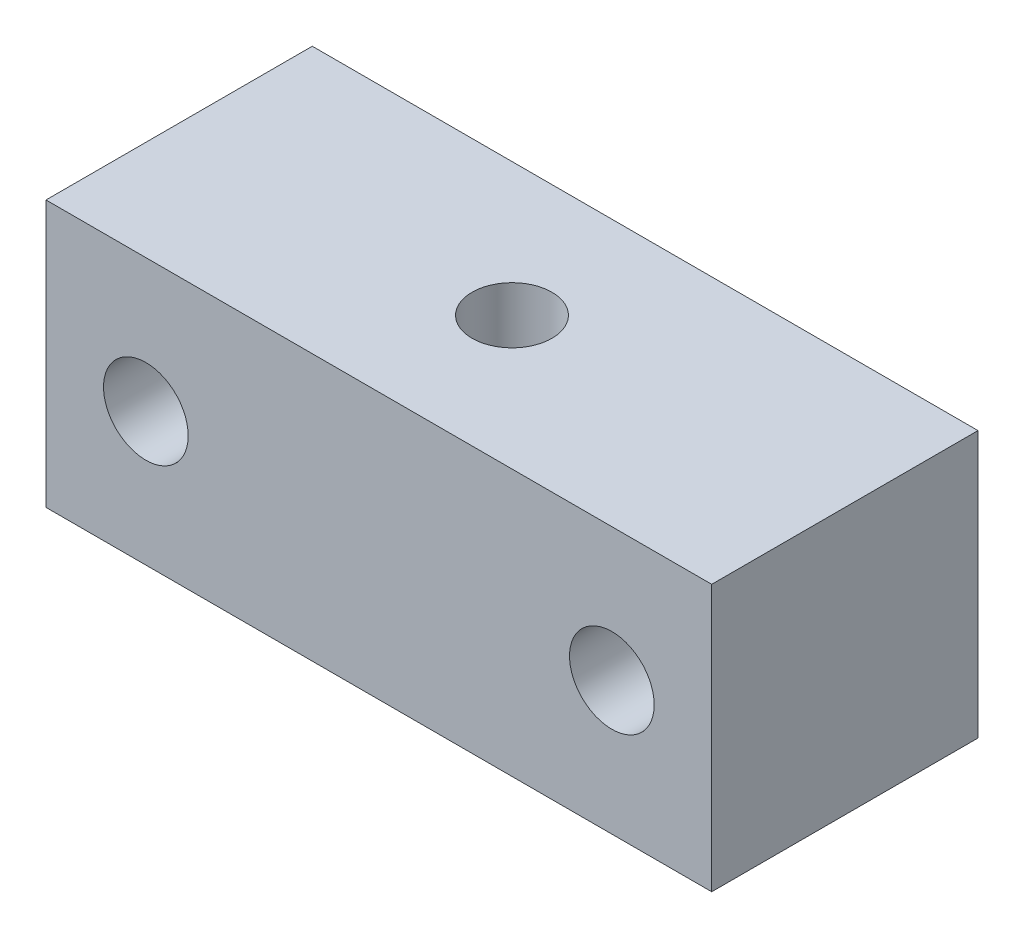
ISO-10303-21;
HEADER;
FILE_DESCRIPTION(('STEP AP214'),'2;1');
FILE_NAME('part.step','',(''),(''),'','','');
FILE_SCHEMA(('AUTOMOTIVE_DESIGN { 1 0 10303 214 1 1 1 1 }'));
ENDSEC;
DATA;
#1=APPLICATION_CONTEXT('core data for automotive mechanical design processes');
#2=APPLICATION_PROTOCOL_DEFINITION('international standard','automotive_design',2000,#1);
#3=PRODUCT_CONTEXT('',#1,'mechanical');
#4=PRODUCT('Part','Part','',(#3));
#5=PRODUCT_RELATED_PRODUCT_CATEGORY('part','',(#4));
#6=PRODUCT_DEFINITION_FORMATION('','',#4);
#7=PRODUCT_DEFINITION_CONTEXT('part definition',#1,'design');
#8=PRODUCT_DEFINITION('design','',#6,#7);
#9=PRODUCT_DEFINITION_SHAPE('','',#8);
#10=(LENGTH_UNIT() NAMED_UNIT(*) SI_UNIT(.MILLI.,.METRE.));
#11=(NAMED_UNIT(*) PLANE_ANGLE_UNIT() SI_UNIT($,.RADIAN.));
#12=(NAMED_UNIT(*) SI_UNIT($,.STERADIAN.) SOLID_ANGLE_UNIT());
#13=UNCERTAINTY_MEASURE_WITH_UNIT(LENGTH_MEASURE(1.E-05),#10,'distance_accuracy_value','');
#14=(GEOMETRIC_REPRESENTATION_CONTEXT(3) GLOBAL_UNCERTAINTY_ASSIGNED_CONTEXT((#13)) GLOBAL_UNIT_ASSIGNED_CONTEXT((#10,
#11,#12)) REPRESENTATION_CONTEXT('',''));
#15=CARTESIAN_POINT('',(0.,0.,0.));
#16=DIRECTION('',(0.,0.,1.));
#17=DIRECTION('',(1.,0.,0.));
#18=AXIS2_PLACEMENT_3D('',#15,#16,#17);
#19=CARTESIAN_POINT('',(0.,0.,6.35));
#20=DIRECTION('',(1.,0.,0.));
#21=DIRECTION('',(0.,0.,-1.));
#22=AXIS2_PLACEMENT_3D('',#19,#20,#21);
#23=PLANE('',#22);
#24=DIRECTION('',(0.,-1.,0.));
#25=VECTOR('',#24,1.);
#26=CARTESIAN_POINT('',(0.,0.,-6.35));
#27=LINE('',#26,#25);
#28=CARTESIAN_POINT('',(0.,12.7,-6.35));
#29=VERTEX_POINT('',#28);
#30=CARTESIAN_POINT('',(0.,0.,-6.35));
#31=VERTEX_POINT('',#30);
#32=EDGE_CURVE('E96',#29,#31,#27,.T.);
#33=ORIENTED_EDGE('',*,*,#32,.T.);
#34=DIRECTION('',(0.,0.,-1.));
#35=VECTOR('',#34,1.);
#36=CARTESIAN_POINT('',(0.,0.,6.35));
#37=LINE('',#36,#35);
#38=CARTESIAN_POINT('',(0.,0.,6.35));
#39=VERTEX_POINT('',#38);
#40=EDGE_CURVE('E11',#39,#31,#37,.T.);
#41=ORIENTED_EDGE('',*,*,#40,.F.);
#42=DIRECTION('',(0.,-1.,0.));
#43=VECTOR('',#42,1.);
#44=CARTESIAN_POINT('',(0.,0.,6.35));
#45=LINE('',#44,#43);
#46=CARTESIAN_POINT('',(0.,12.7,6.35));
#47=VERTEX_POINT('',#46);
#48=EDGE_CURVE('E84',#47,#39,#45,.T.);
#49=ORIENTED_EDGE('',*,*,#48,.F.);
#50=DIRECTION('',(0.,0.,-1.));
#51=VECTOR('',#50,1.);
#52=CARTESIAN_POINT('',(0.,12.7,6.35));
#53=LINE('',#52,#51);
#54=EDGE_CURVE('E92',#47,#29,#53,.T.);
#55=ORIENTED_EDGE('',*,*,#54,.T.);
#56=EDGE_LOOP('',(#33,#41,#49,#55));
#57=FACE_BOUND('',#56,.T.);
#58=ADVANCED_FACE('F33',(#57),#23,.F.);
#59=CARTESIAN_POINT('',(0.,0.,6.35));
#60=DIRECTION('',(0.,1.,0.));
#61=DIRECTION('',(0.,0.,1.));
#62=AXIS2_PLACEMENT_3D('',#59,#60,#61);
#63=PLANE('',#62);
#64=CARTESIAN_POINT('',(15.875,0.,0.));
#65=DIRECTION('',(0.,1.,0.));
#66=DIRECTION('',(0.,0.,1.));
#67=AXIS2_PLACEMENT_3D('',#64,#65,#66);
#68=CIRCLE('',#67,1.905);
#69=CARTESIAN_POINT('',(15.875,0.,1.905));
#70=VERTEX_POINT('',#69);
#71=EDGE_CURVE('E114',#70,#70,#68,.T.);
#72=ORIENTED_EDGE('',*,*,#71,.T.);
#73=EDGE_LOOP('',(#72));
#74=FACE_BOUND('',#73,.T.);
#75=DIRECTION('',(1.,0.,0.));
#76=VECTOR('',#75,1.);
#77=CARTESIAN_POINT('',(0.,0.,-6.35));
#78=LINE('',#77,#76);
#79=CARTESIAN_POINT('',(31.75,0.,-6.35));
#80=VERTEX_POINT('',#79);
#81=EDGE_CURVE('E88',#31,#80,#78,.T.);
#82=ORIENTED_EDGE('',*,*,#81,.T.);
#83=DIRECTION('',(0.,0.,-1.));
#84=VECTOR('',#83,1.);
#85=CARTESIAN_POINT('',(31.75,0.,6.35));
#86=LINE('',#85,#84);
#87=CARTESIAN_POINT('',(31.75,0.,6.35));
#88=VERTEX_POINT('',#87);
#89=EDGE_CURVE('E41',#88,#80,#86,.T.);
#90=ORIENTED_EDGE('',*,*,#89,.F.);
#91=DIRECTION('',(1.,0.,0.));
#92=VECTOR('',#91,1.);
#93=CARTESIAN_POINT('',(0.,0.,6.35));
#94=LINE('',#93,#92);
#95=EDGE_CURVE('E79',#39,#88,#94,.T.);
#96=ORIENTED_EDGE('',*,*,#95,.F.);
#97=ORIENTED_EDGE('',*,*,#40,.T.);
#98=EDGE_LOOP('',(#82,#90,#96,#97));
#99=FACE_BOUND('',#98,.T.);
#100=ADVANCED_FACE('F87',(#74,#99),#63,.F.);
#101=CARTESIAN_POINT('',(31.75,0.,6.35));
#102=DIRECTION('',(-1.,0.,0.));
#103=DIRECTION('',(0.,0.,1.));
#104=AXIS2_PLACEMENT_3D('',#101,#102,#103);
#105=PLANE('',#104);
#106=DIRECTION('',(0.,1.,0.));
#107=VECTOR('',#106,1.);
#108=CARTESIAN_POINT('',(31.75,0.,-6.35));
#109=LINE('',#108,#107);
#110=CARTESIAN_POINT('',(31.75,12.7,-6.35));
#111=VERTEX_POINT('',#110);
#112=EDGE_CURVE('E66',#80,#111,#109,.T.);
#113=ORIENTED_EDGE('',*,*,#112,.T.);
#114=DIRECTION('',(0.,0.,-1.));
#115=VECTOR('',#114,1.);
#116=CARTESIAN_POINT('',(31.75,12.7,6.35));
#117=LINE('',#116,#115);
#118=CARTESIAN_POINT('',(31.75,12.7,6.35));
#119=VERTEX_POINT('',#118);
#120=EDGE_CURVE('E89',#119,#111,#117,.T.);
#121=ORIENTED_EDGE('',*,*,#120,.F.);
#122=DIRECTION('',(0.,1.,0.));
#123=VECTOR('',#122,1.);
#124=CARTESIAN_POINT('',(31.75,0.,6.35));
#125=LINE('',#124,#123);
#126=EDGE_CURVE('E82',#88,#119,#125,.T.);
#127=ORIENTED_EDGE('',*,*,#126,.F.);
#128=ORIENTED_EDGE('',*,*,#89,.T.);
#129=EDGE_LOOP('',(#113,#121,#127,#128));
#130=FACE_BOUND('',#129,.T.);
#131=ADVANCED_FACE('F90',(#130),#105,.F.);
#132=CARTESIAN_POINT('',(0.,12.7,6.35));
#133=DIRECTION('',(0.,-1.,0.));
#134=DIRECTION('',(0.,0.,-1.));
#135=AXIS2_PLACEMENT_3D('',#132,#133,#134);
#136=PLANE('',#135);
#137=CARTESIAN_POINT('',(15.875,12.7,0.));
#138=DIRECTION('',(0.,1.,0.));
#139=DIRECTION('',(0.,0.,1.));
#140=AXIS2_PLACEMENT_3D('',#137,#138,#139);
#141=CIRCLE('',#140,1.905);
#142=CARTESIAN_POINT('',(15.875,12.7,1.905));
#143=VERTEX_POINT('',#142);
#144=EDGE_CURVE('E122',#143,#143,#141,.T.);
#145=ORIENTED_EDGE('',*,*,#144,.F.);
#146=EDGE_LOOP('',(#145));
#147=FACE_BOUND('',#146,.T.);
#148=DIRECTION('',(-1.,0.,0.));
#149=VECTOR('',#148,1.);
#150=CARTESIAN_POINT('',(0.,12.7,-6.35));
#151=LINE('',#150,#149);
#152=EDGE_CURVE('E72',#111,#29,#151,.T.);
#153=ORIENTED_EDGE('',*,*,#152,.T.);
#154=ORIENTED_EDGE('',*,*,#54,.F.);
#155=DIRECTION('',(-1.,0.,0.));
#156=VECTOR('',#155,1.);
#157=CARTESIAN_POINT('',(0.,12.7,6.35));
#158=LINE('',#157,#156);
#159=EDGE_CURVE('E49',#119,#47,#158,.T.);
#160=ORIENTED_EDGE('',*,*,#159,.F.);
#161=ORIENTED_EDGE('',*,*,#120,.T.);
#162=EDGE_LOOP('',(#153,#154,#160,#161));
#163=FACE_BOUND('',#162,.T.);
#164=ADVANCED_FACE('F104',(#147,#163),#136,.F.);
#165=CARTESIAN_POINT('',(0.,0.,6.35));
#166=DIRECTION('',(0.,0.,-1.));
#167=DIRECTION('',(-1.,0.,0.));
#168=AXIS2_PLACEMENT_3D('',#165,#166,#167);
#169=PLANE('',#168);
#170=CARTESIAN_POINT('',(4.7625,6.35,6.35));
#171=DIRECTION('',(0.,0.,1.));
#172=DIRECTION('',(1.,0.,0.));
#173=AXIS2_PLACEMENT_3D('',#170,#171,#172);
#174=CIRCLE('',#173,2.0193);
#175=CARTESIAN_POINT('',(6.7818,6.35,6.35));
#176=VERTEX_POINT('',#175);
#177=EDGE_CURVE('E117',#176,#176,#174,.T.);
#178=ORIENTED_EDGE('',*,*,#177,.F.);
#179=EDGE_LOOP('',(#178));
#180=FACE_BOUND('',#179,.T.);
#181=CARTESIAN_POINT('',(26.9875,6.35,6.35));
#182=DIRECTION('',(0.,0.,1.));
#183=DIRECTION('',(1.,0.,0.));
#184=AXIS2_PLACEMENT_3D('',#181,#182,#183);
#185=CIRCLE('',#184,2.0193);
#186=CARTESIAN_POINT('',(29.0068,6.35,6.35));
#187=VERTEX_POINT('',#186);
#188=EDGE_CURVE('E110',#187,#187,#185,.T.);
#189=ORIENTED_EDGE('',*,*,#188,.F.);
#190=EDGE_LOOP('',(#189));
#191=FACE_BOUND('',#190,.T.);
#192=ORIENTED_EDGE('',*,*,#48,.T.);
#193=ORIENTED_EDGE('',*,*,#95,.T.);
#194=ORIENTED_EDGE('',*,*,#126,.T.);
#195=ORIENTED_EDGE('',*,*,#159,.T.);
#196=EDGE_LOOP('',(#192,#193,#194,#195));
#197=FACE_BOUND('',#196,.T.);
#198=ADVANCED_FACE('F80',(#180,#191,#197),#169,.F.);
#199=CARTESIAN_POINT('',(0.,0.,-6.35));
#200=DIRECTION('',(0.,0.,-1.));
#201=DIRECTION('',(-1.,0.,0.));
#202=AXIS2_PLACEMENT_3D('',#199,#200,#201);
#203=PLANE('',#202);
#204=CARTESIAN_POINT('',(4.7625,6.35,-6.35));
#205=DIRECTION('',(0.,0.,1.));
#206=DIRECTION('',(1.,0.,0.));
#207=AXIS2_PLACEMENT_3D('',#204,#205,#206);
#208=CIRCLE('',#207,2.0193);
#209=CARTESIAN_POINT('',(6.7818,6.35,-6.35));
#210=VERTEX_POINT('',#209);
#211=EDGE_CURVE('E99',#210,#210,#208,.T.);
#212=ORIENTED_EDGE('',*,*,#211,.T.);
#213=EDGE_LOOP('',(#212));
#214=FACE_BOUND('',#213,.T.);
#215=CARTESIAN_POINT('',(26.9875,6.35,-6.35));
#216=DIRECTION('',(0.,0.,1.));
#217=DIRECTION('',(1.,0.,0.));
#218=AXIS2_PLACEMENT_3D('',#215,#216,#217);
#219=CIRCLE('',#218,2.0193);
#220=CARTESIAN_POINT('',(29.0068,6.35,-6.35));
#221=VERTEX_POINT('',#220);
#222=EDGE_CURVE('E113',#221,#221,#219,.T.);
#223=ORIENTED_EDGE('',*,*,#222,.T.);
#224=EDGE_LOOP('',(#223));
#225=FACE_BOUND('',#224,.T.);
#226=ORIENTED_EDGE('',*,*,#32,.F.);
#227=ORIENTED_EDGE('',*,*,#152,.F.);
#228=ORIENTED_EDGE('',*,*,#112,.F.);
#229=ORIENTED_EDGE('',*,*,#81,.F.);
#230=EDGE_LOOP('',(#226,#227,#228,#229));
#231=FACE_BOUND('',#230,.T.);
#232=ADVANCED_FACE('F107',(#214,#225,#231),#203,.T.);
#233=CARTESIAN_POINT('',(26.9875,6.35,-6.35));
#234=DIRECTION('',(0.,0.,1.));
#235=DIRECTION('',(1.,0.,0.));
#236=AXIS2_PLACEMENT_3D('',#233,#234,#235);
#237=CYLINDRICAL_SURFACE('',#236,2.0193);
#238=ORIENTED_EDGE('',*,*,#222,.F.);
#239=EDGE_LOOP('',(#238));
#240=FACE_BOUND('',#239,.T.);
#241=ORIENTED_EDGE('',*,*,#188,.T.);
#242=EDGE_LOOP('',(#241));
#243=FACE_BOUND('',#242,.T.);
#244=ADVANCED_FACE('F175',(#240,#243),#237,.F.);
#245=CARTESIAN_POINT('',(4.7625,6.35,-6.35));
#246=DIRECTION('',(0.,0.,1.));
#247=DIRECTION('',(1.,0.,0.));
#248=AXIS2_PLACEMENT_3D('',#245,#246,#247);
#249=CYLINDRICAL_SURFACE('',#248,2.0193);
#250=ORIENTED_EDGE('',*,*,#211,.F.);
#251=EDGE_LOOP('',(#250));
#252=FACE_BOUND('',#251,.T.);
#253=ORIENTED_EDGE('',*,*,#177,.T.);
#254=EDGE_LOOP('',(#253));
#255=FACE_BOUND('',#254,.T.);
#256=ADVANCED_FACE('F132',(#252,#255),#249,.F.);
#257=CARTESIAN_POINT('',(15.875,0.,0.));
#258=DIRECTION('',(0.,1.,0.));
#259=DIRECTION('',(0.,0.,1.));
#260=AXIS2_PLACEMENT_3D('',#257,#258,#259);
#261=CYLINDRICAL_SURFACE('',#260,1.905);
#262=ORIENTED_EDGE('',*,*,#71,.F.);
#263=EDGE_LOOP('',(#262));
#264=FACE_BOUND('',#263,.T.);
#265=ORIENTED_EDGE('',*,*,#144,.T.);
#266=EDGE_LOOP('',(#265));
#267=FACE_BOUND('',#266,.T.);
#268=ADVANCED_FACE('F129',(#264,#267),#261,.F.);
#269=CLOSED_SHELL('',(#58,#100,#131,#164,#198,#232,#244,#256,#268));
#270=MANIFOLD_SOLID_BREP('B2',#269);
#271=ADVANCED_BREP_SHAPE_REPRESENTATION('',(#18,#270),#14);
#272=SHAPE_DEFINITION_REPRESENTATION(#9,#271);
ENDSEC;
END-ISO-10303-21;
